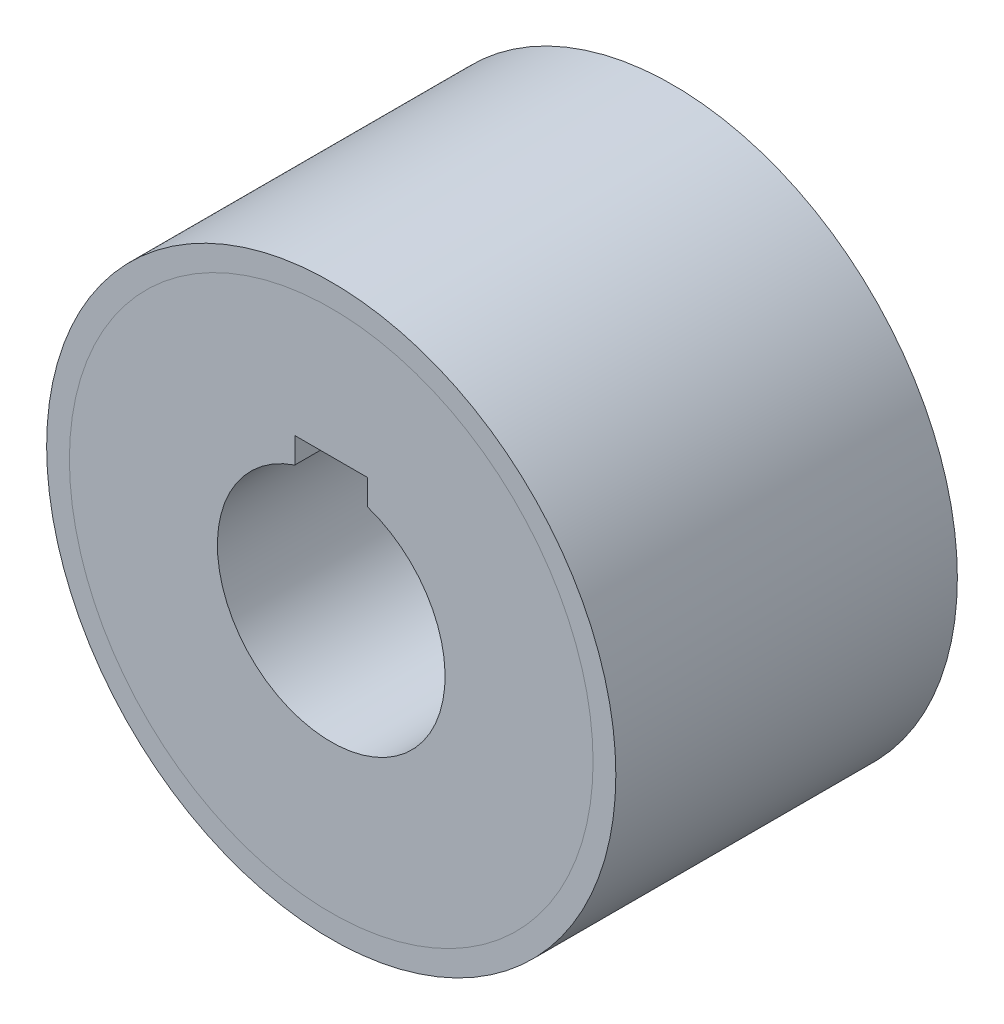
ISO-10303-21;
HEADER;
FILE_DESCRIPTION(('STEP AP214'),'2;1');
FILE_NAME('part.step','',(''),(''),'','','');
FILE_SCHEMA(('AUTOMOTIVE_DESIGN { 1 0 10303 214 1 1 1 1 }'));
ENDSEC;
DATA;
#1=APPLICATION_CONTEXT('core data for automotive mechanical design processes');
#2=APPLICATION_PROTOCOL_DEFINITION('international standard','automotive_design',2000,#1);
#3=PRODUCT_CONTEXT('',#1,'mechanical');
#4=PRODUCT('Part','Part','',(#3));
#5=PRODUCT_RELATED_PRODUCT_CATEGORY('part','',(#4));
#6=PRODUCT_DEFINITION_FORMATION('','',#4);
#7=PRODUCT_DEFINITION_CONTEXT('part definition',#1,'design');
#8=PRODUCT_DEFINITION('design','',#6,#7);
#9=PRODUCT_DEFINITION_SHAPE('','',#8);
#10=(LENGTH_UNIT() NAMED_UNIT(*) SI_UNIT(.MILLI.,.METRE.));
#11=(NAMED_UNIT(*) PLANE_ANGLE_UNIT() SI_UNIT($,.RADIAN.));
#12=(NAMED_UNIT(*) SI_UNIT($,.STERADIAN.) SOLID_ANGLE_UNIT());
#13=UNCERTAINTY_MEASURE_WITH_UNIT(LENGTH_MEASURE(1.E-05),#10,'distance_accuracy_value','');
#14=(GEOMETRIC_REPRESENTATION_CONTEXT(3) GLOBAL_UNCERTAINTY_ASSIGNED_CONTEXT((#13)) GLOBAL_UNIT_ASSIGNED_CONTEXT((#10,
#11,#12)) REPRESENTATION_CONTEXT('',''));
#15=CARTESIAN_POINT('',(0.,0.,0.));
#16=DIRECTION('',(0.,0.,1.));
#17=DIRECTION('',(1.,0.,0.));
#18=AXIS2_PLACEMENT_3D('',#15,#16,#17);
#19=CARTESIAN_POINT('',(0.,0.,-176.776695296637));
#20=DIRECTION('',(0.,0.,1.));
#21=DIRECTION('',(1.,0.,0.));
#22=AXIS2_PLACEMENT_3D('',#19,#20,#21);
#23=CYLINDRICAL_SURFACE('',#22,62.5);
#24=CARTESIAN_POINT('',(0.,0.,0.));
#25=DIRECTION('',(0.,0.,1.));
#26=DIRECTION('',(1.,0.,0.));
#27=AXIS2_PLACEMENT_3D('',#24,#25,#26);
#28=CIRCLE('',#27,62.5);
#29=CARTESIAN_POINT('',(62.5,0.,0.));
#30=VERTEX_POINT('',#29);
#31=EDGE_CURVE('E66',#30,#30,#28,.F.);
#32=ORIENTED_EDGE('',*,*,#31,.F.);
#33=EDGE_LOOP('',(#32));
#34=FACE_BOUND('',#33,.T.);
#35=CARTESIAN_POINT('',(0.,0.,75.));
#36=DIRECTION('',(0.,0.,1.));
#37=DIRECTION('',(1.,0.,0.));
#38=AXIS2_PLACEMENT_3D('',#35,#36,#37);
#39=CIRCLE('',#38,62.5);
#40=CARTESIAN_POINT('',(62.5,0.,75.));
#41=VERTEX_POINT('',#40);
#42=EDGE_CURVE('E70',#41,#41,#39,.T.);
#43=ORIENTED_EDGE('',*,*,#42,.F.);
#44=EDGE_LOOP('',(#43));
#45=FACE_BOUND('',#44,.T.);
#46=ADVANCED_FACE('F60',(#34,#45),#23,.T.);
#47=CARTESIAN_POINT('',(0.,0.,75.));
#48=DIRECTION('',(0.,0.,1.));
#49=DIRECTION('',(1.,0.,0.));
#50=AXIS2_PLACEMENT_3D('',#47,#48,#49);
#51=PLANE('',#50);
#52=CARTESIAN_POINT('',(0.,0.,75.));
#53=DIRECTION('',(0.,0.,1.));
#54=DIRECTION('',(1.,0.,0.));
#55=AXIS2_PLACEMENT_3D('',#52,#53,#54);
#56=CIRCLE('',#55,57.5);
#57=CARTESIAN_POINT('',(57.5,0.,75.));
#58=VERTEX_POINT('',#57);
#59=EDGE_CURVE('E75',#58,#58,#56,.T.);
#60=ORIENTED_EDGE('',*,*,#59,.F.);
#61=EDGE_LOOP('',(#60));
#62=FACE_BOUND('',#61,.T.);
#63=ORIENTED_EDGE('',*,*,#42,.T.);
#64=EDGE_LOOP('',(#63));
#65=FACE_BOUND('',#64,.T.);
#66=ADVANCED_FACE('F82',(#62,#65),#51,.T.);
#67=CARTESIAN_POINT('',(0.,0.,-176.776695296637));
#68=DIRECTION('',(0.,0.,1.));
#69=DIRECTION('',(1.,0.,0.));
#70=AXIS2_PLACEMENT_3D('',#67,#68,#69);
#71=CYLINDRICAL_SURFACE('',#70,57.5);
#72=CARTESIAN_POINT('',(0.,0.,0.));
#73=DIRECTION('',(0.,0.,1.));
#74=DIRECTION('',(1.,0.,0.));
#75=AXIS2_PLACEMENT_3D('',#72,#73,#74);
#76=CIRCLE('',#75,57.5);
#77=CARTESIAN_POINT('',(57.5,0.,0.));
#78=VERTEX_POINT('',#77);
#79=EDGE_CURVE('E13',#78,#78,#76,.F.);
#80=ORIENTED_EDGE('',*,*,#79,.T.);
#81=EDGE_LOOP('',(#80));
#82=FACE_BOUND('',#81,.T.);
#83=ORIENTED_EDGE('',*,*,#59,.T.);
#84=EDGE_LOOP('',(#83));
#85=FACE_BOUND('',#84,.T.);
#86=ADVANCED_FACE('F80',(#82,#85),#71,.F.);
#87=CARTESIAN_POINT('',(0.,0.,0.));
#88=DIRECTION('',(0.,0.,1.));
#89=DIRECTION('',(1.,0.,0.));
#90=AXIS2_PLACEMENT_3D('',#87,#88,#89);
#91=PLANE('',#90);
#92=ORIENTED_EDGE('',*,*,#31,.T.);
#93=EDGE_LOOP('',(#92));
#94=FACE_BOUND('',#93,.T.);
#95=ORIENTED_EDGE('',*,*,#79,.F.);
#96=EDGE_LOOP('',(#95));
#97=FACE_BOUND('',#96,.T.);
#98=ADVANCED_FACE('F101',(#94,#97),#91,.F.);
#99=CLOSED_SHELL('',(#46,#66,#86,#98));
#100=MANIFOLD_SOLID_BREP('B2',#99);
#101=CARTESIAN_POINT('',(0.,0.,75.));
#102=DIRECTION('',(0.,0.,-1.));
#103=DIRECTION('',(-1.,0.,0.));
#104=AXIS2_PLACEMENT_3D('',#101,#102,#103);
#105=CYLINDRICAL_SURFACE('',#104,57.5);
#106=CARTESIAN_POINT('',(0.,0.,75.));
#107=DIRECTION('',(0.,0.,1.));
#108=DIRECTION('',(1.,0.,0.));
#109=AXIS2_PLACEMENT_3D('',#106,#107,#108);
#110=CIRCLE('',#109,57.5);
#111=CARTESIAN_POINT('',(57.5,0.,75.));
#112=VERTEX_POINT('',#111);
#113=EDGE_CURVE('E58',#112,#112,#110,.T.);
#114=ORIENTED_EDGE('',*,*,#113,.F.);
#115=EDGE_LOOP('',(#114));
#116=FACE_BOUND('',#115,.T.);
#117=CARTESIAN_POINT('',(0.,0.,0.));
#118=DIRECTION('',(0.,0.,1.));
#119=DIRECTION('',(1.,0.,0.));
#120=AXIS2_PLACEMENT_3D('',#117,#118,#119);
#121=CIRCLE('',#120,57.5);
#122=CARTESIAN_POINT('',(57.5,0.,0.));
#123=VERTEX_POINT('',#122);
#124=EDGE_CURVE('E122',#123,#123,#121,.T.);
#125=ORIENTED_EDGE('',*,*,#124,.T.);
#126=EDGE_LOOP('',(#125));
#127=FACE_BOUND('',#126,.T.);
#128=ADVANCED_FACE('F119',(#116,#127),#105,.T.);
#129=CARTESIAN_POINT('',(0.,0.,75.));
#130=DIRECTION('',(0.,0.,1.));
#131=DIRECTION('',(1.,0.,0.));
#132=AXIS2_PLACEMENT_3D('',#129,#130,#131);
#133=PLANE('',#132);
#134=DIRECTION('',(0.,-1.,0.));
#135=VECTOR('',#134,1.);
#136=CARTESIAN_POINT('',(-8.,23.685438564654,75.));
#137=LINE('',#136,#135);
#138=CARTESIAN_POINT('',(-8.,29.3,75.));
#139=VERTEX_POINT('',#138);
#140=CARTESIAN_POINT('',(-8.,23.685438564654,75.));
#141=VERTEX_POINT('',#140);
#142=EDGE_CURVE('E158',#139,#141,#137,.T.);
#143=ORIENTED_EDGE('',*,*,#142,.F.);
#144=DIRECTION('',(-1.,0.,0.));
#145=VECTOR('',#144,1.);
#146=CARTESIAN_POINT('',(-8.,29.3,75.));
#147=LINE('',#146,#145);
#148=CARTESIAN_POINT('',(8.,29.3,75.));
#149=VERTEX_POINT('',#148);
#150=EDGE_CURVE('E183',#149,#139,#147,.T.);
#151=ORIENTED_EDGE('',*,*,#150,.F.);
#152=DIRECTION('',(0.,1.,0.));
#153=VECTOR('',#152,1.);
#154=CARTESIAN_POINT('',(8.,23.685438564654,75.));
#155=LINE('',#154,#153);
#156=CARTESIAN_POINT('',(8.,23.685438564654,75.));
#157=VERTEX_POINT('',#156);
#158=EDGE_CURVE('E164',#157,#149,#155,.T.);
#159=ORIENTED_EDGE('',*,*,#158,.F.);
#160=CARTESIAN_POINT('',(0.,0.,75.));
#161=DIRECTION('',(0.,0.,1.));
#162=DIRECTION('',(1.,0.,0.));
#163=AXIS2_PLACEMENT_3D('',#160,#161,#162);
#164=CIRCLE('',#163,25.);
#165=EDGE_CURVE('E190',#141,#157,#164,.T.);
#166=ORIENTED_EDGE('',*,*,#165,.F.);
#167=EDGE_LOOP('',(#143,#151,#159,#166));
#168=FACE_BOUND('',#167,.T.);
#169=ORIENTED_EDGE('',*,*,#113,.T.);
#170=EDGE_LOOP('',(#169));
#171=FACE_BOUND('',#170,.T.);
#172=ADVANCED_FACE('F199',(#168,#171),#133,.T.);
#173=CARTESIAN_POINT('',(0.,0.,0.));
#174=DIRECTION('',(0.,0.,1.));
#175=DIRECTION('',(1.,0.,0.));
#176=AXIS2_PLACEMENT_3D('',#173,#174,#175);
#177=PLANE('',#176);
#178=DIRECTION('',(-1.,0.,0.));
#179=VECTOR('',#178,1.);
#180=CARTESIAN_POINT('',(-8.,29.3,0.));
#181=LINE('',#180,#179);
#182=CARTESIAN_POINT('',(8.,29.3,0.));
#183=VERTEX_POINT('',#182);
#184=CARTESIAN_POINT('',(-8.,29.3,0.));
#185=VERTEX_POINT('',#184);
#186=EDGE_CURVE('E172',#183,#185,#181,.T.);
#187=ORIENTED_EDGE('',*,*,#186,.T.);
#188=DIRECTION('',(0.,-1.,0.));
#189=VECTOR('',#188,1.);
#190=CARTESIAN_POINT('',(-8.,23.685438564654,0.));
#191=LINE('',#190,#189);
#192=CARTESIAN_POINT('',(-8.,23.685438564654,0.));
#193=VERTEX_POINT('',#192);
#194=EDGE_CURVE('E175',#185,#193,#191,.T.);
#195=ORIENTED_EDGE('',*,*,#194,.T.);
#196=CARTESIAN_POINT('',(0.,0.,0.));
#197=DIRECTION('',(0.,0.,1.));
#198=DIRECTION('',(1.,0.,0.));
#199=AXIS2_PLACEMENT_3D('',#196,#197,#198);
#200=CIRCLE('',#199,25.);
#201=CARTESIAN_POINT('',(8.,23.685438564654,0.));
#202=VERTEX_POINT('',#201);
#203=EDGE_CURVE('E181',#193,#202,#200,.T.);
#204=ORIENTED_EDGE('',*,*,#203,.T.);
#205=DIRECTION('',(0.,1.,0.));
#206=VECTOR('',#205,1.);
#207=CARTESIAN_POINT('',(8.,23.685438564654,0.));
#208=LINE('',#207,#206);
#209=EDGE_CURVE('E133',#202,#183,#208,.T.);
#210=ORIENTED_EDGE('',*,*,#209,.T.);
#211=EDGE_LOOP('',(#187,#195,#204,#210));
#212=FACE_BOUND('',#211,.T.);
#213=ORIENTED_EDGE('',*,*,#124,.F.);
#214=EDGE_LOOP('',(#213));
#215=FACE_BOUND('',#214,.T.);
#216=ADVANCED_FACE('F178',(#212,#215),#177,.F.);
#217=CARTESIAN_POINT('',(0.,0.,0.));
#218=DIRECTION('',(0.,0.,1.));
#219=DIRECTION('',(1.,0.,0.));
#220=AXIS2_PLACEMENT_3D('',#217,#218,#219);
#221=CYLINDRICAL_SURFACE('',#220,25.);
#222=ORIENTED_EDGE('',*,*,#203,.F.);
#223=DIRECTION('',(0.,0.,1.));
#224=VECTOR('',#223,1.);
#225=CARTESIAN_POINT('',(-8.,23.685438564654,0.));
#226=LINE('',#225,#224);
#227=EDGE_CURVE('E142',#193,#141,#226,.T.);
#228=ORIENTED_EDGE('',*,*,#227,.T.);
#229=ORIENTED_EDGE('',*,*,#165,.T.);
#230=DIRECTION('',(0.,0.,1.));
#231=VECTOR('',#230,1.);
#232=CARTESIAN_POINT('',(8.,23.685438564654,0.));
#233=LINE('',#232,#231);
#234=EDGE_CURVE('E169',#202,#157,#233,.T.);
#235=ORIENTED_EDGE('',*,*,#234,.F.);
#236=EDGE_LOOP('',(#222,#228,#229,#235));
#237=FACE_BOUND('',#236,.T.);
#238=ADVANCED_FACE('F197',(#237),#221,.F.);
#239=CARTESIAN_POINT('',(-8.,23.685438564654,0.));
#240=DIRECTION('',(-1.,0.,0.));
#241=DIRECTION('',(0.,0.,1.));
#242=AXIS2_PLACEMENT_3D('',#239,#240,#241);
#243=PLANE('',#242);
#244=ORIENTED_EDGE('',*,*,#142,.T.);
#245=ORIENTED_EDGE('',*,*,#227,.F.);
#246=ORIENTED_EDGE('',*,*,#194,.F.);
#247=DIRECTION('',(0.,0.,1.));
#248=VECTOR('',#247,1.);
#249=CARTESIAN_POINT('',(-8.,29.3,0.));
#250=LINE('',#249,#248);
#251=EDGE_CURVE('E168',#185,#139,#250,.T.);
#252=ORIENTED_EDGE('',*,*,#251,.T.);
#253=EDGE_LOOP('',(#244,#245,#246,#252));
#254=FACE_BOUND('',#253,.T.);
#255=ADVANCED_FACE('F213',(#254),#243,.F.);
#256=CARTESIAN_POINT('',(-8.,29.3,0.));
#257=DIRECTION('',(0.,1.,0.));
#258=DIRECTION('',(0.,0.,1.));
#259=AXIS2_PLACEMENT_3D('',#256,#257,#258);
#260=PLANE('',#259);
#261=ORIENTED_EDGE('',*,*,#150,.T.);
#262=ORIENTED_EDGE('',*,*,#251,.F.);
#263=ORIENTED_EDGE('',*,*,#186,.F.);
#264=DIRECTION('',(0.,0.,1.));
#265=VECTOR('',#264,1.);
#266=CARTESIAN_POINT('',(8.,29.3,0.));
#267=LINE('',#266,#265);
#268=EDGE_CURVE('E160',#183,#149,#267,.T.);
#269=ORIENTED_EDGE('',*,*,#268,.T.);
#270=EDGE_LOOP('',(#261,#262,#263,#269));
#271=FACE_BOUND('',#270,.T.);
#272=ADVANCED_FACE('F173',(#271),#260,.F.);
#273=CARTESIAN_POINT('',(8.,23.685438564654,0.));
#274=DIRECTION('',(1.,0.,0.));
#275=DIRECTION('',(0.,0.,-1.));
#276=AXIS2_PLACEMENT_3D('',#273,#274,#275);
#277=PLANE('',#276);
#278=ORIENTED_EDGE('',*,*,#158,.T.);
#279=ORIENTED_EDGE('',*,*,#268,.F.);
#280=ORIENTED_EDGE('',*,*,#209,.F.);
#281=ORIENTED_EDGE('',*,*,#234,.T.);
#282=EDGE_LOOP('',(#278,#279,#280,#281));
#283=FACE_BOUND('',#282,.T.);
#284=ADVANCED_FACE('F162',(#283),#277,.F.);
#285=CLOSED_SHELL('',(#128,#172,#216,#238,#255,#272,#284));
#286=MANIFOLD_SOLID_BREP('B8',#285);
#287=ADVANCED_BREP_SHAPE_REPRESENTATION('',(#18,#100,#286),#14);
#288=SHAPE_DEFINITION_REPRESENTATION(#9,#287);
ENDSEC;
END-ISO-10303-21;
